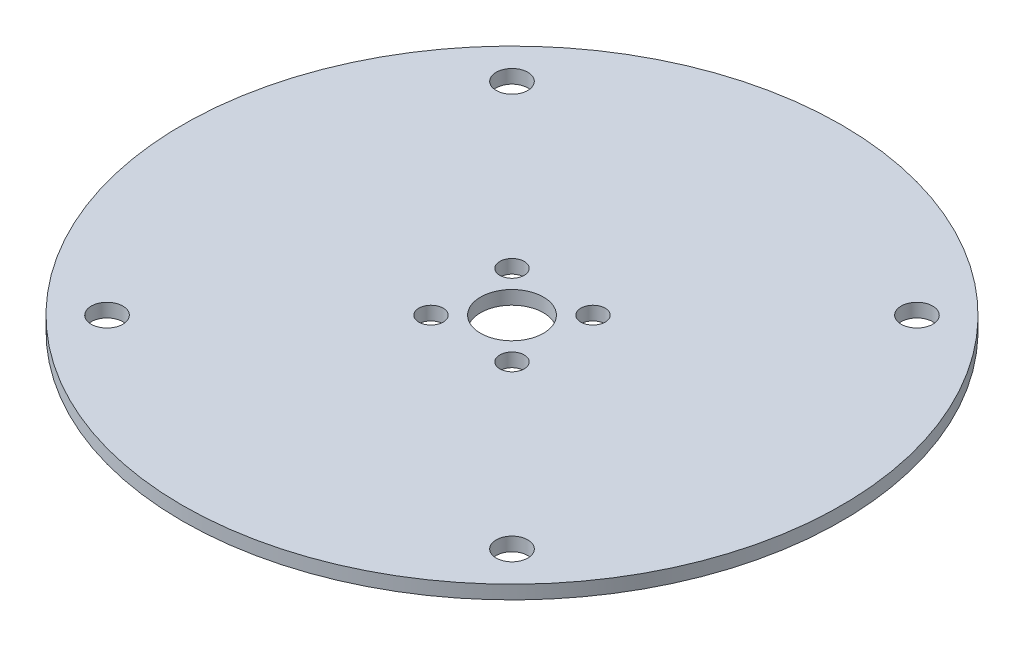
ISO-10303-21;
HEADER;
FILE_DESCRIPTION(('STEP AP214'),'2;1');
FILE_NAME('part.step','',(''),(''),'','','');
FILE_SCHEMA(('AUTOMOTIVE_DESIGN { 1 0 10303 214 1 1 1 1 }'));
ENDSEC;
DATA;
#1=APPLICATION_CONTEXT('core data for automotive mechanical design processes');
#2=APPLICATION_PROTOCOL_DEFINITION('international standard','automotive_design',2000,#1);
#3=PRODUCT_CONTEXT('',#1,'mechanical');
#4=PRODUCT('Part','Part','',(#3));
#5=PRODUCT_RELATED_PRODUCT_CATEGORY('part','',(#4));
#6=PRODUCT_DEFINITION_FORMATION('','',#4);
#7=PRODUCT_DEFINITION_CONTEXT('part definition',#1,'design');
#8=PRODUCT_DEFINITION('design','',#6,#7);
#9=PRODUCT_DEFINITION_SHAPE('','',#8);
#10=(LENGTH_UNIT() NAMED_UNIT(*) SI_UNIT(.MILLI.,.METRE.));
#11=(NAMED_UNIT(*) PLANE_ANGLE_UNIT() SI_UNIT($,.RADIAN.));
#12=(NAMED_UNIT(*) SI_UNIT($,.STERADIAN.) SOLID_ANGLE_UNIT());
#13=UNCERTAINTY_MEASURE_WITH_UNIT(LENGTH_MEASURE(1.E-05),#10,'distance_accuracy_value','');
#14=(GEOMETRIC_REPRESENTATION_CONTEXT(3) GLOBAL_UNCERTAINTY_ASSIGNED_CONTEXT((#13)) GLOBAL_UNIT_ASSIGNED_CONTEXT((#10,
#11,#12)) REPRESENTATION_CONTEXT('',''));
#15=CARTESIAN_POINT('',(0.,0.,0.));
#16=DIRECTION('',(0.,0.,1.));
#17=DIRECTION('',(1.,0.,0.));
#18=AXIS2_PLACEMENT_3D('',#15,#16,#17);
#19=CARTESIAN_POINT('',(0.,1.68,0.));
#20=DIRECTION('',(0.,1.,0.));
#21=DIRECTION('',(0.,0.,1.));
#22=AXIS2_PLACEMENT_3D('',#19,#20,#21);
#23=PLANE('',#22);
#24=CARTESIAN_POINT('',(-5.,1.68,5.));
#25=DIRECTION('',(0.,1.,0.));
#26=DIRECTION('',(0.,0.,1.));
#27=AXIS2_PLACEMENT_3D('',#24,#25,#26);
#28=CIRCLE('',#27,1.5);
#29=CARTESIAN_POINT('',(-5.,1.68,6.5));
#30=VERTEX_POINT('',#29);
#31=EDGE_CURVE('E84',#30,#30,#28,.T.);
#32=ORIENTED_EDGE('',*,*,#31,.F.);
#33=EDGE_LOOP('',(#32));
#34=FACE_BOUND('',#33,.T.);
#35=CARTESIAN_POINT('',(5.,1.68,-5.));
#36=DIRECTION('',(0.,1.,0.));
#37=DIRECTION('',(0.,0.,1.));
#38=AXIS2_PLACEMENT_3D('',#35,#36,#37);
#39=CIRCLE('',#38,1.5);
#40=CARTESIAN_POINT('',(5.,1.68,-3.5));
#41=VERTEX_POINT('',#40);
#42=EDGE_CURVE('E72',#41,#41,#39,.T.);
#43=ORIENTED_EDGE('',*,*,#42,.F.);
#44=EDGE_LOOP('',(#43));
#45=FACE_BOUND('',#44,.T.);
#46=CARTESIAN_POINT('',(-25.,1.68,25.0000000000001));
#47=DIRECTION('',(0.,1.,0.));
#48=DIRECTION('',(0.,0.,1.));
#49=AXIS2_PLACEMENT_3D('',#46,#47,#48);
#50=CIRCLE('',#49,1.95);
#51=CARTESIAN_POINT('',(-25.,1.68,26.9500000000001));
#52=VERTEX_POINT('',#51);
#53=EDGE_CURVE('E60',#52,#52,#50,.T.);
#54=ORIENTED_EDGE('',*,*,#53,.F.);
#55=EDGE_LOOP('',(#54));
#56=FACE_BOUND('',#55,.T.);
#57=CARTESIAN_POINT('',(-25.,1.68,-25.0000000000001));
#58=DIRECTION('',(0.,1.,0.));
#59=DIRECTION('',(0.,0.,1.));
#60=AXIS2_PLACEMENT_3D('',#57,#58,#59);
#61=CIRCLE('',#60,1.95);
#62=CARTESIAN_POINT('',(-25.,1.68,-23.0500000000001));
#63=VERTEX_POINT('',#62);
#64=EDGE_CURVE('E48',#63,#63,#61,.T.);
#65=ORIENTED_EDGE('',*,*,#64,.F.);
#66=EDGE_LOOP('',(#65));
#67=FACE_BOUND('',#66,.T.);
#68=CARTESIAN_POINT('',(0.,1.68,0.));
#69=DIRECTION('',(0.,1.,0.));
#70=DIRECTION('',(0.,0.,1.));
#71=AXIS2_PLACEMENT_3D('',#68,#69,#70);
#72=CIRCLE('',#71,40.69);
#73=CARTESIAN_POINT('',(0.,1.68,40.69));
#74=VERTEX_POINT('',#73);
#75=EDGE_CURVE('E10',#74,#74,#72,.T.);
#76=ORIENTED_EDGE('',*,*,#75,.T.);
#77=EDGE_LOOP('',(#76));
#78=FACE_BOUND('',#77,.T.);
#79=CARTESIAN_POINT('',(25.,1.68,-25.0000000000001));
#80=DIRECTION('',(0.,1.,0.));
#81=DIRECTION('',(0.,0.,1.));
#82=AXIS2_PLACEMENT_3D('',#79,#80,#81);
#83=CIRCLE('',#82,1.95);
#84=CARTESIAN_POINT('',(25.,1.68,-23.0500000000001));
#85=VERTEX_POINT('',#84);
#86=EDGE_CURVE('E43',#85,#85,#83,.T.);
#87=ORIENTED_EDGE('',*,*,#86,.F.);
#88=EDGE_LOOP('',(#87));
#89=FACE_BOUND('',#88,.T.);
#90=CARTESIAN_POINT('',(25.,1.68,25.0000000000001));
#91=DIRECTION('',(0.,1.,0.));
#92=DIRECTION('',(0.,0.,1.));
#93=AXIS2_PLACEMENT_3D('',#90,#91,#92);
#94=CIRCLE('',#93,1.95);
#95=CARTESIAN_POINT('',(25.,1.68,26.9500000000001));
#96=VERTEX_POINT('',#95);
#97=EDGE_CURVE('E54',#96,#96,#94,.T.);
#98=ORIENTED_EDGE('',*,*,#97,.F.);
#99=EDGE_LOOP('',(#98));
#100=FACE_BOUND('',#99,.T.);
#101=CARTESIAN_POINT('',(-5.,1.68,-5.));
#102=DIRECTION('',(0.,1.,0.));
#103=DIRECTION('',(0.,0.,1.));
#104=AXIS2_PLACEMENT_3D('',#101,#102,#103);
#105=CIRCLE('',#104,1.5);
#106=CARTESIAN_POINT('',(-5.,1.68,-3.5));
#107=VERTEX_POINT('',#106);
#108=EDGE_CURVE('E66',#107,#107,#105,.T.);
#109=ORIENTED_EDGE('',*,*,#108,.F.);
#110=EDGE_LOOP('',(#109));
#111=FACE_BOUND('',#110,.T.);
#112=CARTESIAN_POINT('',(5.,1.68,5.));
#113=DIRECTION('',(0.,1.,0.));
#114=DIRECTION('',(0.,0.,1.));
#115=AXIS2_PLACEMENT_3D('',#112,#113,#114);
#116=CIRCLE('',#115,1.5);
#117=CARTESIAN_POINT('',(5.,1.68,6.5));
#118=VERTEX_POINT('',#117);
#119=EDGE_CURVE('E78',#118,#118,#116,.T.);
#120=ORIENTED_EDGE('',*,*,#119,.F.);
#121=EDGE_LOOP('',(#120));
#122=FACE_BOUND('',#121,.T.);
#123=CARTESIAN_POINT('',(0.,1.68,0.));
#124=DIRECTION('',(0.,1.,0.));
#125=DIRECTION('',(0.,0.,1.));
#126=AXIS2_PLACEMENT_3D('',#123,#124,#125);
#127=CIRCLE('',#126,3.88);
#128=CARTESIAN_POINT('',(0.,1.68,3.88));
#129=VERTEX_POINT('',#128);
#130=EDGE_CURVE('E90',#129,#129,#127,.T.);
#131=ORIENTED_EDGE('',*,*,#130,.F.);
#132=EDGE_LOOP('',(#131));
#133=FACE_BOUND('',#132,.T.);
#134=ADVANCED_FACE('F32',(#34,#45,#56,#67,#78,#89,#100,#111,#122,#133),#23,.T.);
#135=CARTESIAN_POINT('',(0.,0.,0.));
#136=DIRECTION('',(0.,1.,0.));
#137=DIRECTION('',(0.,0.,1.));
#138=AXIS2_PLACEMENT_3D('',#135,#136,#137);
#139=PLANE('',#138);
#140=CARTESIAN_POINT('',(0.,0.,0.));
#141=DIRECTION('',(0.,1.,0.));
#142=DIRECTION('',(0.,0.,1.));
#143=AXIS2_PLACEMENT_3D('',#140,#141,#142);
#144=CIRCLE('',#143,40.69);
#145=CARTESIAN_POINT('',(0.,0.,40.69));
#146=VERTEX_POINT('',#145);
#147=EDGE_CURVE('E36',#146,#146,#144,.T.);
#148=ORIENTED_EDGE('',*,*,#147,.F.);
#149=EDGE_LOOP('',(#148));
#150=FACE_BOUND('',#149,.T.);
#151=CARTESIAN_POINT('',(25.,0.,-25.0000000000001));
#152=DIRECTION('',(0.,1.,0.));
#153=DIRECTION('',(0.,0.,1.));
#154=AXIS2_PLACEMENT_3D('',#151,#152,#153);
#155=CIRCLE('',#154,1.95);
#156=CARTESIAN_POINT('',(25.,0.,-23.0500000000001));
#157=VERTEX_POINT('',#156);
#158=EDGE_CURVE('E45',#157,#157,#155,.T.);
#159=ORIENTED_EDGE('',*,*,#158,.T.);
#160=EDGE_LOOP('',(#159));
#161=FACE_BOUND('',#160,.T.);
#162=CARTESIAN_POINT('',(-25.,0.,-25.0000000000001));
#163=DIRECTION('',(0.,1.,0.));
#164=DIRECTION('',(0.,0.,1.));
#165=AXIS2_PLACEMENT_3D('',#162,#163,#164);
#166=CIRCLE('',#165,1.95);
#167=CARTESIAN_POINT('',(-25.,0.,-23.0500000000001));
#168=VERTEX_POINT('',#167);
#169=EDGE_CURVE('E51',#168,#168,#166,.T.);
#170=ORIENTED_EDGE('',*,*,#169,.T.);
#171=EDGE_LOOP('',(#170));
#172=FACE_BOUND('',#171,.T.);
#173=CARTESIAN_POINT('',(25.,0.,25.0000000000001));
#174=DIRECTION('',(0.,1.,0.));
#175=DIRECTION('',(0.,0.,1.));
#176=AXIS2_PLACEMENT_3D('',#173,#174,#175);
#177=CIRCLE('',#176,1.95);
#178=CARTESIAN_POINT('',(25.,0.,26.9500000000001));
#179=VERTEX_POINT('',#178);
#180=EDGE_CURVE('E57',#179,#179,#177,.T.);
#181=ORIENTED_EDGE('',*,*,#180,.T.);
#182=EDGE_LOOP('',(#181));
#183=FACE_BOUND('',#182,.T.);
#184=CARTESIAN_POINT('',(-25.,0.,25.0000000000001));
#185=DIRECTION('',(0.,1.,0.));
#186=DIRECTION('',(0.,0.,1.));
#187=AXIS2_PLACEMENT_3D('',#184,#185,#186);
#188=CIRCLE('',#187,1.95);
#189=CARTESIAN_POINT('',(-25.,0.,26.9500000000001));
#190=VERTEX_POINT('',#189);
#191=EDGE_CURVE('E63',#190,#190,#188,.T.);
#192=ORIENTED_EDGE('',*,*,#191,.T.);
#193=EDGE_LOOP('',(#192));
#194=FACE_BOUND('',#193,.T.);
#195=CARTESIAN_POINT('',(-5.,0.,-5.));
#196=DIRECTION('',(0.,1.,0.));
#197=DIRECTION('',(0.,0.,1.));
#198=AXIS2_PLACEMENT_3D('',#195,#196,#197);
#199=CIRCLE('',#198,1.5);
#200=CARTESIAN_POINT('',(-5.,0.,-3.5));
#201=VERTEX_POINT('',#200);
#202=EDGE_CURVE('E69',#201,#201,#199,.T.);
#203=ORIENTED_EDGE('',*,*,#202,.T.);
#204=EDGE_LOOP('',(#203));
#205=FACE_BOUND('',#204,.T.);
#206=CARTESIAN_POINT('',(5.,0.,-5.));
#207=DIRECTION('',(0.,1.,0.));
#208=DIRECTION('',(0.,0.,1.));
#209=AXIS2_PLACEMENT_3D('',#206,#207,#208);
#210=CIRCLE('',#209,1.5);
#211=CARTESIAN_POINT('',(5.,0.,-3.5));
#212=VERTEX_POINT('',#211);
#213=EDGE_CURVE('E75',#212,#212,#210,.T.);
#214=ORIENTED_EDGE('',*,*,#213,.T.);
#215=EDGE_LOOP('',(#214));
#216=FACE_BOUND('',#215,.T.);
#217=CARTESIAN_POINT('',(5.,0.,5.));
#218=DIRECTION('',(0.,1.,0.));
#219=DIRECTION('',(0.,0.,1.));
#220=AXIS2_PLACEMENT_3D('',#217,#218,#219);
#221=CIRCLE('',#220,1.5);
#222=CARTESIAN_POINT('',(5.,0.,6.5));
#223=VERTEX_POINT('',#222);
#224=EDGE_CURVE('E81',#223,#223,#221,.T.);
#225=ORIENTED_EDGE('',*,*,#224,.T.);
#226=EDGE_LOOP('',(#225));
#227=FACE_BOUND('',#226,.T.);
#228=CARTESIAN_POINT('',(-5.,0.,5.));
#229=DIRECTION('',(0.,1.,0.));
#230=DIRECTION('',(0.,0.,1.));
#231=AXIS2_PLACEMENT_3D('',#228,#229,#230);
#232=CIRCLE('',#231,1.5);
#233=CARTESIAN_POINT('',(-5.,0.,6.5));
#234=VERTEX_POINT('',#233);
#235=EDGE_CURVE('E87',#234,#234,#232,.T.);
#236=ORIENTED_EDGE('',*,*,#235,.T.);
#237=EDGE_LOOP('',(#236));
#238=FACE_BOUND('',#237,.T.);
#239=CARTESIAN_POINT('',(0.,0.,0.));
#240=DIRECTION('',(0.,1.,0.));
#241=DIRECTION('',(0.,0.,1.));
#242=AXIS2_PLACEMENT_3D('',#239,#240,#241);
#243=CIRCLE('',#242,3.88);
#244=CARTESIAN_POINT('',(0.,0.,3.88));
#245=VERTEX_POINT('',#244);
#246=EDGE_CURVE('E93',#245,#245,#243,.T.);
#247=ORIENTED_EDGE('',*,*,#246,.T.);
#248=EDGE_LOOP('',(#247));
#249=FACE_BOUND('',#248,.T.);
#250=ADVANCED_FACE('F103',(#150,#161,#172,#183,#194,#205,#216,#227,#238,#249),#139,.F.);
#251=CARTESIAN_POINT('',(0.,1.68,0.));
#252=DIRECTION('',(0.,-1.,0.));
#253=DIRECTION('',(0.,0.,-1.));
#254=AXIS2_PLACEMENT_3D('',#251,#252,#253);
#255=CYLINDRICAL_SURFACE('',#254,40.69);
#256=ORIENTED_EDGE('',*,*,#75,.F.);
#257=EDGE_LOOP('',(#256));
#258=FACE_BOUND('',#257,.T.);
#259=ORIENTED_EDGE('',*,*,#147,.T.);
#260=EDGE_LOOP('',(#259));
#261=FACE_BOUND('',#260,.T.);
#262=ADVANCED_FACE('F34',(#258,#261),#255,.T.);
#263=CARTESIAN_POINT('',(25.,1.68,-25.0000000000001));
#264=DIRECTION('',(0.,-1.,0.));
#265=DIRECTION('',(0.,0.,-1.));
#266=AXIS2_PLACEMENT_3D('',#263,#264,#265);
#267=CYLINDRICAL_SURFACE('',#266,1.95);
#268=ORIENTED_EDGE('',*,*,#86,.T.);
#269=EDGE_LOOP('',(#268));
#270=FACE_BOUND('',#269,.T.);
#271=ORIENTED_EDGE('',*,*,#158,.F.);
#272=EDGE_LOOP('',(#271));
#273=FACE_BOUND('',#272,.T.);
#274=ADVANCED_FACE('F113',(#270,#273),#267,.F.);
#275=CARTESIAN_POINT('',(-25.,1.68,-25.0000000000001));
#276=DIRECTION('',(0.,-1.,0.));
#277=DIRECTION('',(0.,0.,-1.));
#278=AXIS2_PLACEMENT_3D('',#275,#276,#277);
#279=CYLINDRICAL_SURFACE('',#278,1.95);
#280=ORIENTED_EDGE('',*,*,#64,.T.);
#281=EDGE_LOOP('',(#280));
#282=FACE_BOUND('',#281,.T.);
#283=ORIENTED_EDGE('',*,*,#169,.F.);
#284=EDGE_LOOP('',(#283));
#285=FACE_BOUND('',#284,.T.);
#286=ADVANCED_FACE('F116',(#282,#285),#279,.F.);
#287=CARTESIAN_POINT('',(25.,1.68,25.0000000000001));
#288=DIRECTION('',(0.,-1.,0.));
#289=DIRECTION('',(0.,0.,-1.));
#290=AXIS2_PLACEMENT_3D('',#287,#288,#289);
#291=CYLINDRICAL_SURFACE('',#290,1.95);
#292=ORIENTED_EDGE('',*,*,#97,.T.);
#293=EDGE_LOOP('',(#292));
#294=FACE_BOUND('',#293,.T.);
#295=ORIENTED_EDGE('',*,*,#180,.F.);
#296=EDGE_LOOP('',(#295));
#297=FACE_BOUND('',#296,.T.);
#298=ADVANCED_FACE('F120',(#294,#297),#291,.F.);
#299=CARTESIAN_POINT('',(-25.,1.68,25.0000000000001));
#300=DIRECTION('',(0.,-1.,0.));
#301=DIRECTION('',(0.,0.,-1.));
#302=AXIS2_PLACEMENT_3D('',#299,#300,#301);
#303=CYLINDRICAL_SURFACE('',#302,1.95);
#304=ORIENTED_EDGE('',*,*,#53,.T.);
#305=EDGE_LOOP('',(#304));
#306=FACE_BOUND('',#305,.T.);
#307=ORIENTED_EDGE('',*,*,#191,.F.);
#308=EDGE_LOOP('',(#307));
#309=FACE_BOUND('',#308,.T.);
#310=ADVANCED_FACE('F124',(#306,#309),#303,.F.);
#311=CARTESIAN_POINT('',(-5.,1.68,-5.));
#312=DIRECTION('',(0.,-1.,0.));
#313=DIRECTION('',(0.,0.,-1.));
#314=AXIS2_PLACEMENT_3D('',#311,#312,#313);
#315=CYLINDRICAL_SURFACE('',#314,1.5);
#316=ORIENTED_EDGE('',*,*,#108,.T.);
#317=EDGE_LOOP('',(#316));
#318=FACE_BOUND('',#317,.T.);
#319=ORIENTED_EDGE('',*,*,#202,.F.);
#320=EDGE_LOOP('',(#319));
#321=FACE_BOUND('',#320,.T.);
#322=ADVANCED_FACE('F128',(#318,#321),#315,.F.);
#323=CARTESIAN_POINT('',(5.,1.68,-5.));
#324=DIRECTION('',(0.,-1.,0.));
#325=DIRECTION('',(0.,0.,-1.));
#326=AXIS2_PLACEMENT_3D('',#323,#324,#325);
#327=CYLINDRICAL_SURFACE('',#326,1.5);
#328=ORIENTED_EDGE('',*,*,#42,.T.);
#329=EDGE_LOOP('',(#328));
#330=FACE_BOUND('',#329,.T.);
#331=ORIENTED_EDGE('',*,*,#213,.F.);
#332=EDGE_LOOP('',(#331));
#333=FACE_BOUND('',#332,.T.);
#334=ADVANCED_FACE('F132',(#330,#333),#327,.F.);
#335=CARTESIAN_POINT('',(5.,1.68,5.));
#336=DIRECTION('',(0.,-1.,0.));
#337=DIRECTION('',(0.,0.,-1.));
#338=AXIS2_PLACEMENT_3D('',#335,#336,#337);
#339=CYLINDRICAL_SURFACE('',#338,1.5);
#340=ORIENTED_EDGE('',*,*,#119,.T.);
#341=EDGE_LOOP('',(#340));
#342=FACE_BOUND('',#341,.T.);
#343=ORIENTED_EDGE('',*,*,#224,.F.);
#344=EDGE_LOOP('',(#343));
#345=FACE_BOUND('',#344,.T.);
#346=ADVANCED_FACE('F136',(#342,#345),#339,.F.);
#347=CARTESIAN_POINT('',(-5.,1.68,5.));
#348=DIRECTION('',(0.,-1.,0.));
#349=DIRECTION('',(0.,0.,-1.));
#350=AXIS2_PLACEMENT_3D('',#347,#348,#349);
#351=CYLINDRICAL_SURFACE('',#350,1.5);
#352=ORIENTED_EDGE('',*,*,#31,.T.);
#353=EDGE_LOOP('',(#352));
#354=FACE_BOUND('',#353,.T.);
#355=ORIENTED_EDGE('',*,*,#235,.F.);
#356=EDGE_LOOP('',(#355));
#357=FACE_BOUND('',#356,.T.);
#358=ADVANCED_FACE('F140',(#354,#357),#351,.F.);
#359=CARTESIAN_POINT('',(0.,1.68,0.));
#360=DIRECTION('',(0.,-1.,0.));
#361=DIRECTION('',(0.,0.,-1.));
#362=AXIS2_PLACEMENT_3D('',#359,#360,#361);
#363=CYLINDRICAL_SURFACE('',#362,3.88);
#364=ORIENTED_EDGE('',*,*,#130,.T.);
#365=EDGE_LOOP('',(#364));
#366=FACE_BOUND('',#365,.T.);
#367=ORIENTED_EDGE('',*,*,#246,.F.);
#368=EDGE_LOOP('',(#367));
#369=FACE_BOUND('',#368,.T.);
#370=ADVANCED_FACE('F99',(#366,#369),#363,.F.);
#371=CLOSED_SHELL('',(#134,#250,#262,#274,#286,#298,#310,#322,#334,#346,#358,#370));
#372=MANIFOLD_SOLID_BREP('B2',#371);
#373=ADVANCED_BREP_SHAPE_REPRESENTATION('',(#18,#372),#14);
#374=SHAPE_DEFINITION_REPRESENTATION(#9,#373);
ENDSEC;
END-ISO-10303-21;
